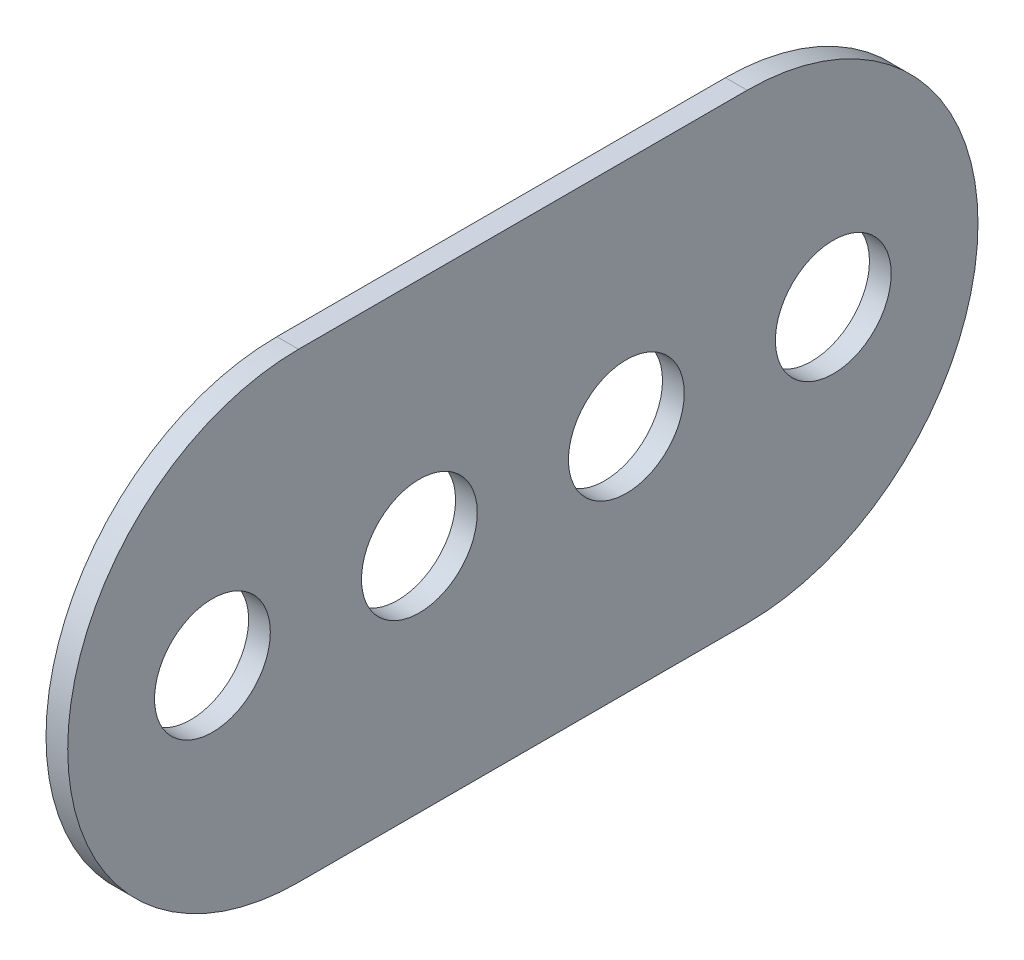
ISO-10303-21;
HEADER;
FILE_DESCRIPTION(('STEP AP214'),'2;1');
FILE_NAME('part.step','',(''),(''),'','','');
FILE_SCHEMA(('AUTOMOTIVE_DESIGN { 1 0 10303 214 1 1 1 1 }'));
ENDSEC;
DATA;
#1=APPLICATION_CONTEXT('core data for automotive mechanical design processes');
#2=APPLICATION_PROTOCOL_DEFINITION('international standard','automotive_design',2000,#1);
#3=PRODUCT_CONTEXT('',#1,'mechanical');
#4=PRODUCT('Part','Part','',(#3));
#5=PRODUCT_RELATED_PRODUCT_CATEGORY('part','',(#4));
#6=PRODUCT_DEFINITION_FORMATION('','',#4);
#7=PRODUCT_DEFINITION_CONTEXT('part definition',#1,'design');
#8=PRODUCT_DEFINITION('design','',#6,#7);
#9=PRODUCT_DEFINITION_SHAPE('','',#8);
#10=(LENGTH_UNIT() NAMED_UNIT(*) SI_UNIT(.MILLI.,.METRE.));
#11=(NAMED_UNIT(*) PLANE_ANGLE_UNIT() SI_UNIT($,.RADIAN.));
#12=(NAMED_UNIT(*) SI_UNIT($,.STERADIAN.) SOLID_ANGLE_UNIT());
#13=UNCERTAINTY_MEASURE_WITH_UNIT(LENGTH_MEASURE(1.E-05),#10,'distance_accuracy_value','');
#14=(GEOMETRIC_REPRESENTATION_CONTEXT(3) GLOBAL_UNCERTAINTY_ASSIGNED_CONTEXT((#13)) GLOBAL_UNIT_ASSIGNED_CONTEXT((#10,
#11,#12)) REPRESENTATION_CONTEXT('',''));
#15=CARTESIAN_POINT('',(0.,0.,0.));
#16=DIRECTION('',(0.,0.,1.));
#17=DIRECTION('',(1.,0.,0.));
#18=AXIS2_PLACEMENT_3D('',#15,#16,#17);
#19=CARTESIAN_POINT('',(1.5,0.,31.));
#20=DIRECTION('',(-1.,0.,0.));
#21=DIRECTION('',(0.,0.,1.));
#22=AXIS2_PLACEMENT_3D('',#19,#20,#21);
#23=CYLINDRICAL_SURFACE('',#22,31.9);
#24=CARTESIAN_POINT('',(-1.5,0.,31.));
#25=DIRECTION('',(1.,0.,0.));
#26=DIRECTION('',(0.,0.,-1.));
#27=AXIS2_PLACEMENT_3D('',#24,#25,#26);
#28=CIRCLE('',#27,31.9);
#29=CARTESIAN_POINT('',(-1.5,31.9,31.));
#30=VERTEX_POINT('',#29);
#31=CARTESIAN_POINT('',(-1.5,-31.9,31.));
#32=VERTEX_POINT('',#31);
#33=EDGE_CURVE('E104',#30,#32,#28,.T.);
#34=ORIENTED_EDGE('',*,*,#33,.T.);
#35=DIRECTION('',(-1.,0.,0.));
#36=VECTOR('',#35,1.);
#37=CARTESIAN_POINT('',(1.5,-31.9,31.));
#38=LINE('',#37,#36);
#39=CARTESIAN_POINT('',(1.5,-31.9,31.));
#40=VERTEX_POINT('',#39);
#41=EDGE_CURVE('E11',#40,#32,#38,.T.);
#42=ORIENTED_EDGE('',*,*,#41,.F.);
#43=CARTESIAN_POINT('',(1.5,0.,31.));
#44=DIRECTION('',(1.,0.,0.));
#45=DIRECTION('',(0.,0.,-1.));
#46=AXIS2_PLACEMENT_3D('',#43,#44,#45);
#47=CIRCLE('',#46,31.9);
#48=CARTESIAN_POINT('',(1.5,31.9,31.));
#49=VERTEX_POINT('',#48);
#50=EDGE_CURVE('E92',#49,#40,#47,.T.);
#51=ORIENTED_EDGE('',*,*,#50,.F.);
#52=DIRECTION('',(-1.,0.,0.));
#53=VECTOR('',#52,1.);
#54=CARTESIAN_POINT('',(1.5,31.9,31.));
#55=LINE('',#54,#53);
#56=EDGE_CURVE('E100',#49,#30,#55,.T.);
#57=ORIENTED_EDGE('',*,*,#56,.T.);
#58=EDGE_LOOP('',(#34,#42,#51,#57));
#59=FACE_BOUND('',#58,.T.);
#60=ADVANCED_FACE('F41',(#59),#23,.T.);
#61=CARTESIAN_POINT('',(1.5,-31.9,31.));
#62=DIRECTION('',(0.,1.,0.));
#63=DIRECTION('',(0.,0.,1.));
#64=AXIS2_PLACEMENT_3D('',#61,#62,#63);
#65=PLANE('',#64);
#66=DIRECTION('',(0.,0.,-1.));
#67=VECTOR('',#66,1.);
#68=CARTESIAN_POINT('',(-1.5,-31.9,31.));
#69=LINE('',#68,#67);
#70=CARTESIAN_POINT('',(-1.5,-31.9,-31.));
#71=VERTEX_POINT('',#70);
#72=EDGE_CURVE('E96',#32,#71,#69,.T.);
#73=ORIENTED_EDGE('',*,*,#72,.T.);
#74=DIRECTION('',(-1.,0.,0.));
#75=VECTOR('',#74,1.);
#76=CARTESIAN_POINT('',(1.5,-31.9,-31.));
#77=LINE('',#76,#75);
#78=CARTESIAN_POINT('',(1.5,-31.9,-31.));
#79=VERTEX_POINT('',#78);
#80=EDGE_CURVE('E49',#79,#71,#77,.T.);
#81=ORIENTED_EDGE('',*,*,#80,.F.);
#82=DIRECTION('',(0.,0.,-1.));
#83=VECTOR('',#82,1.);
#84=CARTESIAN_POINT('',(1.5,-31.9,31.));
#85=LINE('',#84,#83);
#86=EDGE_CURVE('E87',#40,#79,#85,.T.);
#87=ORIENTED_EDGE('',*,*,#86,.F.);
#88=ORIENTED_EDGE('',*,*,#41,.T.);
#89=EDGE_LOOP('',(#73,#81,#87,#88));
#90=FACE_BOUND('',#89,.T.);
#91=ADVANCED_FACE('F95',(#90),#65,.F.);
#92=CARTESIAN_POINT('',(1.5,0.,-31.));
#93=DIRECTION('',(-1.,0.,0.));
#94=DIRECTION('',(0.,0.,1.));
#95=AXIS2_PLACEMENT_3D('',#92,#93,#94);
#96=CYLINDRICAL_SURFACE('',#95,31.9);
#97=CARTESIAN_POINT('',(-1.5,0.,-31.));
#98=DIRECTION('',(1.,0.,0.));
#99=DIRECTION('',(0.,0.,-1.));
#100=AXIS2_PLACEMENT_3D('',#97,#98,#99);
#101=CIRCLE('',#100,31.9);
#102=CARTESIAN_POINT('',(-1.5,31.9,-31.));
#103=VERTEX_POINT('',#102);
#104=EDGE_CURVE('E74',#71,#103,#101,.T.);
#105=ORIENTED_EDGE('',*,*,#104,.T.);
#106=DIRECTION('',(-1.,0.,0.));
#107=VECTOR('',#106,1.);
#108=CARTESIAN_POINT('',(1.5,31.9,-31.));
#109=LINE('',#108,#107);
#110=CARTESIAN_POINT('',(1.5,31.9,-31.));
#111=VERTEX_POINT('',#110);
#112=EDGE_CURVE('E97',#111,#103,#109,.T.);
#113=ORIENTED_EDGE('',*,*,#112,.F.);
#114=CARTESIAN_POINT('',(1.5,0.,-31.));
#115=DIRECTION('',(1.,0.,0.));
#116=DIRECTION('',(0.,0.,-1.));
#117=AXIS2_PLACEMENT_3D('',#114,#115,#116);
#118=CIRCLE('',#117,31.9);
#119=EDGE_CURVE('E90',#79,#111,#118,.T.);
#120=ORIENTED_EDGE('',*,*,#119,.F.);
#121=ORIENTED_EDGE('',*,*,#80,.T.);
#122=EDGE_LOOP('',(#105,#113,#120,#121));
#123=FACE_BOUND('',#122,.T.);
#124=ADVANCED_FACE('F98',(#123),#96,.T.);
#125=CARTESIAN_POINT('',(1.5,31.9,31.));
#126=DIRECTION('',(0.,-1.,0.));
#127=DIRECTION('',(0.,0.,-1.));
#128=AXIS2_PLACEMENT_3D('',#125,#126,#127);
#129=PLANE('',#128);
#130=DIRECTION('',(0.,0.,1.));
#131=VECTOR('',#130,1.);
#132=CARTESIAN_POINT('',(-1.5,31.9,31.));
#133=LINE('',#132,#131);
#134=EDGE_CURVE('E80',#103,#30,#133,.T.);
#135=ORIENTED_EDGE('',*,*,#134,.T.);
#136=ORIENTED_EDGE('',*,*,#56,.F.);
#137=DIRECTION('',(0.,0.,1.));
#138=VECTOR('',#137,1.);
#139=CARTESIAN_POINT('',(1.5,31.9,31.));
#140=LINE('',#139,#138);
#141=EDGE_CURVE('E57',#111,#49,#140,.T.);
#142=ORIENTED_EDGE('',*,*,#141,.F.);
#143=ORIENTED_EDGE('',*,*,#112,.T.);
#144=EDGE_LOOP('',(#135,#136,#142,#143));
#145=FACE_BOUND('',#144,.T.);
#146=ADVANCED_FACE('F112',(#145),#129,.F.);
#147=CARTESIAN_POINT('',(1.5,0.,31.));
#148=DIRECTION('',(1.,0.,0.));
#149=DIRECTION('',(0.,0.,-1.));
#150=AXIS2_PLACEMENT_3D('',#147,#148,#149);
#151=PLANE('',#150);
#152=CARTESIAN_POINT('',(1.5,0.,42.9));
#153=DIRECTION('',(1.,0.,0.));
#154=DIRECTION('',(0.,0.,-1.));
#155=AXIS2_PLACEMENT_3D('',#152,#153,#154);
#156=CIRCLE('',#155,8.);
#157=CARTESIAN_POINT('',(1.5,0.,34.9));
#158=VERTEX_POINT('',#157);
#159=EDGE_CURVE('E121',#158,#158,#156,.T.);
#160=ORIENTED_EDGE('',*,*,#159,.F.);
#161=EDGE_LOOP('',(#160));
#162=FACE_BOUND('',#161,.T.);
#163=CARTESIAN_POINT('',(1.5,0.,-42.9));
#164=DIRECTION('',(1.,0.,0.));
#165=DIRECTION('',(0.,0.,-1.));
#166=AXIS2_PLACEMENT_3D('',#163,#164,#165);
#167=CIRCLE('',#166,8.);
#168=CARTESIAN_POINT('',(1.5,0.,-50.9));
#169=VERTEX_POINT('',#168);
#170=EDGE_CURVE('E127',#169,#169,#167,.T.);
#171=ORIENTED_EDGE('',*,*,#170,.F.);
#172=EDGE_LOOP('',(#171));
#173=FACE_BOUND('',#172,.T.);
#174=CARTESIAN_POINT('',(1.5,0.,-14.3));
#175=DIRECTION('',(1.,0.,0.));
#176=DIRECTION('',(0.,0.,-1.));
#177=AXIS2_PLACEMENT_3D('',#174,#175,#176);
#178=CIRCLE('',#177,8.);
#179=CARTESIAN_POINT('',(1.5,0.,-22.3));
#180=VERTEX_POINT('',#179);
#181=EDGE_CURVE('E128',#180,#180,#178,.T.);
#182=ORIENTED_EDGE('',*,*,#181,.F.);
#183=EDGE_LOOP('',(#182));
#184=FACE_BOUND('',#183,.T.);
#185=CARTESIAN_POINT('',(1.5,0.,14.3));
#186=DIRECTION('',(1.,0.,0.));
#187=DIRECTION('',(0.,0.,-1.));
#188=AXIS2_PLACEMENT_3D('',#185,#186,#187);
#189=CIRCLE('',#188,8.);
#190=CARTESIAN_POINT('',(1.5,0.,6.3));
#191=VERTEX_POINT('',#190);
#192=EDGE_CURVE('E118',#191,#191,#189,.T.);
#193=ORIENTED_EDGE('',*,*,#192,.F.);
#194=EDGE_LOOP('',(#193));
#195=FACE_BOUND('',#194,.T.);
#196=ORIENTED_EDGE('',*,*,#50,.T.);
#197=ORIENTED_EDGE('',*,*,#86,.T.);
#198=ORIENTED_EDGE('',*,*,#119,.T.);
#199=ORIENTED_EDGE('',*,*,#141,.T.);
#200=EDGE_LOOP('',(#196,#197,#198,#199));
#201=FACE_BOUND('',#200,.T.);
#202=ADVANCED_FACE('F88',(#162,#173,#184,#195,#201),#151,.T.);
#203=CARTESIAN_POINT('',(-1.5,0.,31.));
#204=DIRECTION('',(1.,0.,0.));
#205=DIRECTION('',(0.,0.,-1.));
#206=AXIS2_PLACEMENT_3D('',#203,#204,#205);
#207=PLANE('',#206);
#208=CARTESIAN_POINT('',(-1.50000000000001,0.,42.9));
#209=DIRECTION('',(1.,0.,0.));
#210=DIRECTION('',(0.,0.,-1.));
#211=AXIS2_PLACEMENT_3D('',#208,#209,#210);
#212=CIRCLE('',#211,8.);
#213=CARTESIAN_POINT('',(-1.50000000000001,0.,34.9));
#214=VERTEX_POINT('',#213);
#215=EDGE_CURVE('E131',#214,#214,#212,.T.);
#216=ORIENTED_EDGE('',*,*,#215,.T.);
#217=EDGE_LOOP('',(#216));
#218=FACE_BOUND('',#217,.T.);
#219=CARTESIAN_POINT('',(-1.5,0.,-42.9));
#220=DIRECTION('',(1.,0.,0.));
#221=DIRECTION('',(0.,0.,-1.));
#222=AXIS2_PLACEMENT_3D('',#219,#220,#221);
#223=CIRCLE('',#222,8.);
#224=CARTESIAN_POINT('',(-1.5,0.,-50.9));
#225=VERTEX_POINT('',#224);
#226=EDGE_CURVE('E124',#225,#225,#223,.T.);
#227=ORIENTED_EDGE('',*,*,#226,.T.);
#228=EDGE_LOOP('',(#227));
#229=FACE_BOUND('',#228,.T.);
#230=CARTESIAN_POINT('',(-1.5,0.,-14.3));
#231=DIRECTION('',(1.,0.,0.));
#232=DIRECTION('',(0.,0.,-1.));
#233=AXIS2_PLACEMENT_3D('',#230,#231,#232);
#234=CIRCLE('',#233,8.);
#235=CARTESIAN_POINT('',(-1.5,0.,-22.3));
#236=VERTEX_POINT('',#235);
#237=EDGE_CURVE('E136',#236,#236,#234,.T.);
#238=ORIENTED_EDGE('',*,*,#237,.T.);
#239=EDGE_LOOP('',(#238));
#240=FACE_BOUND('',#239,.T.);
#241=CARTESIAN_POINT('',(-1.5,0.,14.3));
#242=DIRECTION('',(1.,0.,0.));
#243=DIRECTION('',(0.,0.,-1.));
#244=AXIS2_PLACEMENT_3D('',#241,#242,#243);
#245=CIRCLE('',#244,8.);
#246=CARTESIAN_POINT('',(-1.5,0.,6.3));
#247=VERTEX_POINT('',#246);
#248=EDGE_CURVE('E107',#247,#247,#245,.T.);
#249=ORIENTED_EDGE('',*,*,#248,.T.);
#250=EDGE_LOOP('',(#249));
#251=FACE_BOUND('',#250,.T.);
#252=ORIENTED_EDGE('',*,*,#33,.F.);
#253=ORIENTED_EDGE('',*,*,#134,.F.);
#254=ORIENTED_EDGE('',*,*,#104,.F.);
#255=ORIENTED_EDGE('',*,*,#72,.F.);
#256=EDGE_LOOP('',(#252,#253,#254,#255));
#257=FACE_BOUND('',#256,.T.);
#258=ADVANCED_FACE('F115',(#218,#229,#240,#251,#257),#207,.F.);
#259=CARTESIAN_POINT('',(-1.5,0.,14.3));
#260=DIRECTION('',(1.,0.,0.));
#261=DIRECTION('',(0.,0.,-1.));
#262=AXIS2_PLACEMENT_3D('',#259,#260,#261);
#263=CYLINDRICAL_SURFACE('',#262,8.);
#264=ORIENTED_EDGE('',*,*,#248,.F.);
#265=EDGE_LOOP('',(#264));
#266=FACE_BOUND('',#265,.T.);
#267=ORIENTED_EDGE('',*,*,#192,.T.);
#268=EDGE_LOOP('',(#267));
#269=FACE_BOUND('',#268,.T.);
#270=ADVANCED_FACE('F150',(#266,#269),#263,.F.);
#271=CARTESIAN_POINT('',(-1.5,0.,-14.3));
#272=DIRECTION('',(1.,0.,0.));
#273=DIRECTION('',(0.,0.,-1.));
#274=AXIS2_PLACEMENT_3D('',#271,#272,#273);
#275=CYLINDRICAL_SURFACE('',#274,8.);
#276=ORIENTED_EDGE('',*,*,#237,.F.);
#277=EDGE_LOOP('',(#276));
#278=FACE_BOUND('',#277,.T.);
#279=ORIENTED_EDGE('',*,*,#181,.T.);
#280=EDGE_LOOP('',(#279));
#281=FACE_BOUND('',#280,.T.);
#282=ADVANCED_FACE('F142',(#278,#281),#275,.F.);
#283=CARTESIAN_POINT('',(-1.5,0.,-42.9));
#284=DIRECTION('',(1.,0.,0.));
#285=DIRECTION('',(0.,0.,-1.));
#286=AXIS2_PLACEMENT_3D('',#283,#284,#285);
#287=CYLINDRICAL_SURFACE('',#286,8.);
#288=ORIENTED_EDGE('',*,*,#226,.F.);
#289=EDGE_LOOP('',(#288));
#290=FACE_BOUND('',#289,.T.);
#291=ORIENTED_EDGE('',*,*,#170,.T.);
#292=EDGE_LOOP('',(#291));
#293=FACE_BOUND('',#292,.T.);
#294=ADVANCED_FACE('F158',(#290,#293),#287,.F.);
#295=CARTESIAN_POINT('',(-1.50000000000001,0.,42.9));
#296=DIRECTION('',(1.,0.,0.));
#297=DIRECTION('',(0.,0.,-1.));
#298=AXIS2_PLACEMENT_3D('',#295,#296,#297);
#299=CYLINDRICAL_SURFACE('',#298,8.);
#300=ORIENTED_EDGE('',*,*,#215,.F.);
#301=EDGE_LOOP('',(#300));
#302=FACE_BOUND('',#301,.T.);
#303=ORIENTED_EDGE('',*,*,#159,.T.);
#304=EDGE_LOOP('',(#303));
#305=FACE_BOUND('',#304,.T.);
#306=ADVANCED_FACE('F209',(#302,#305),#299,.F.);
#307=CLOSED_SHELL('',(#60,#91,#124,#146,#202,#258,#270,#282,#294,#306));
#308=MANIFOLD_SOLID_BREP('B2',#307);
#309=ADVANCED_BREP_SHAPE_REPRESENTATION('',(#18,#308),#14);
#310=SHAPE_DEFINITION_REPRESENTATION(#9,#309);
ENDSEC;
END-ISO-10303-21;
